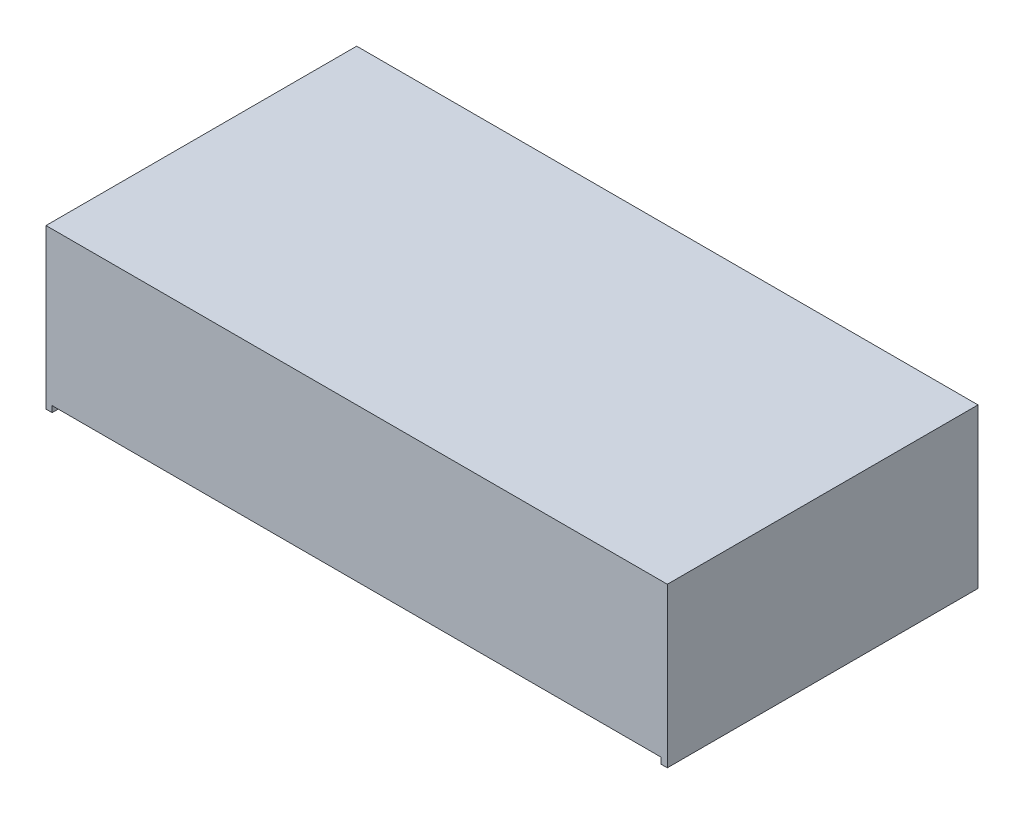
ISO-10303-21;
HEADER;
FILE_DESCRIPTION(('STEP AP214'),'2;1');
FILE_NAME('part.step','',(''),(''),'','','');
FILE_SCHEMA(('AUTOMOTIVE_DESIGN { 1 0 10303 214 1 1 1 1 }'));
ENDSEC;
DATA;
#1=APPLICATION_CONTEXT('core data for automotive mechanical design processes');
#2=APPLICATION_PROTOCOL_DEFINITION('international standard','automotive_design',2000,#1);
#3=PRODUCT_CONTEXT('',#1,'mechanical');
#4=PRODUCT('Part','Part','',(#3));
#5=PRODUCT_RELATED_PRODUCT_CATEGORY('part','',(#4));
#6=PRODUCT_DEFINITION_FORMATION('','',#4);
#7=PRODUCT_DEFINITION_CONTEXT('part definition',#1,'design');
#8=PRODUCT_DEFINITION('design','',#6,#7);
#9=PRODUCT_DEFINITION_SHAPE('','',#8);
#10=(LENGTH_UNIT() NAMED_UNIT(*) SI_UNIT(.MILLI.,.METRE.));
#11=(NAMED_UNIT(*) PLANE_ANGLE_UNIT() SI_UNIT($,.RADIAN.));
#12=(NAMED_UNIT(*) SI_UNIT($,.STERADIAN.) SOLID_ANGLE_UNIT());
#13=UNCERTAINTY_MEASURE_WITH_UNIT(LENGTH_MEASURE(1.E-05),#10,'distance_accuracy_value','');
#14=(GEOMETRIC_REPRESENTATION_CONTEXT(3) GLOBAL_UNCERTAINTY_ASSIGNED_CONTEXT((#13)) GLOBAL_UNIT_ASSIGNED_CONTEXT((#10,
#11,#12)) REPRESENTATION_CONTEXT('',''));
#15=CARTESIAN_POINT('',(0.,0.,0.));
#16=DIRECTION('',(0.,0.,1.));
#17=DIRECTION('',(1.,0.,0.));
#18=AXIS2_PLACEMENT_3D('',#15,#16,#17);
#19=CARTESIAN_POINT('',(25.4,0.,12.7));
#20=DIRECTION('',(0.,1.,0.));
#21=DIRECTION('',(0.,0.,1.));
#22=AXIS2_PLACEMENT_3D('',#19,#20,#21);
#23=PLANE('',#22);
#24=DIRECTION('',(-1.,0.,0.));
#25=VECTOR('',#24,1.);
#26=CARTESIAN_POINT('',(-25.4,0.,-12.7));
#27=LINE('',#26,#25);
#28=CARTESIAN_POINT('',(-24.9,0.,-12.7));
#29=VERTEX_POINT('',#28);
#30=CARTESIAN_POINT('',(-25.4,0.,-12.7));
#31=VERTEX_POINT('',#30);
#32=EDGE_CURVE('E122',#29,#31,#27,.T.);
#33=ORIENTED_EDGE('',*,*,#32,.F.);
#34=DIRECTION('',(0.,0.,-1.));
#35=VECTOR('',#34,1.);
#36=CARTESIAN_POINT('',(-24.9,0.,-12.701));
#37=LINE('',#36,#35);
#38=CARTESIAN_POINT('',(-24.9,0.,12.7));
#39=VERTEX_POINT('',#38);
#40=EDGE_CURVE('E107',#39,#29,#37,.T.);
#41=ORIENTED_EDGE('',*,*,#40,.F.);
#42=DIRECTION('',(1.,0.,0.));
#43=VECTOR('',#42,1.);
#44=CARTESIAN_POINT('',(-25.4,0.,12.7));
#45=LINE('',#44,#43);
#46=CARTESIAN_POINT('',(-25.4,0.,12.7));
#47=VERTEX_POINT('',#46);
#48=EDGE_CURVE('E121',#47,#39,#45,.T.);
#49=ORIENTED_EDGE('',*,*,#48,.F.);
#50=DIRECTION('',(0.,0.,1.));
#51=VECTOR('',#50,1.);
#52=CARTESIAN_POINT('',(-25.4,0.,-12.7));
#53=LINE('',#52,#51);
#54=EDGE_CURVE('E133',#31,#47,#53,.T.);
#55=ORIENTED_EDGE('',*,*,#54,.F.);
#56=EDGE_LOOP('',(#33,#41,#49,#55));
#57=FACE_BOUND('',#56,.T.);
#58=ADVANCED_FACE('F30',(#57),#23,.F.);
#59=CARTESIAN_POINT('',(25.4,13.,-12.7));
#60=DIRECTION('',(-1.,0.,0.));
#61=DIRECTION('',(0.,0.,1.));
#62=AXIS2_PLACEMENT_3D('',#59,#60,#61);
#63=PLANE('',#62);
#64=DIRECTION('',(0.,0.,-1.));
#65=VECTOR('',#64,1.);
#66=CARTESIAN_POINT('',(25.4,0.,-12.7));
#67=LINE('',#66,#65);
#68=CARTESIAN_POINT('',(25.4,0.,12.7));
#69=VERTEX_POINT('',#68);
#70=CARTESIAN_POINT('',(25.4,0.,-12.7));
#71=VERTEX_POINT('',#70);
#72=EDGE_CURVE('E146',#69,#71,#67,.T.);
#73=ORIENTED_EDGE('',*,*,#72,.T.);
#74=DIRECTION('',(0.,-1.,0.));
#75=VECTOR('',#74,1.);
#76=CARTESIAN_POINT('',(25.4,13.,-12.7));
#77=LINE('',#76,#75);
#78=CARTESIAN_POINT('',(25.4,13.,-12.7));
#79=VERTEX_POINT('',#78);
#80=EDGE_CURVE('E11',#79,#71,#77,.T.);
#81=ORIENTED_EDGE('',*,*,#80,.F.);
#82=DIRECTION('',(0.,0.,-1.));
#83=VECTOR('',#82,1.);
#84=CARTESIAN_POINT('',(25.4,13.,-12.7));
#85=LINE('',#84,#83);
#86=CARTESIAN_POINT('',(25.4,13.,12.7));
#87=VERTEX_POINT('',#86);
#88=EDGE_CURVE('E130',#87,#79,#85,.T.);
#89=ORIENTED_EDGE('',*,*,#88,.F.);
#90=DIRECTION('',(0.,-1.,0.));
#91=VECTOR('',#90,1.);
#92=CARTESIAN_POINT('',(25.4,13.,12.7));
#93=LINE('',#92,#91);
#94=EDGE_CURVE('E137',#87,#69,#93,.T.);
#95=ORIENTED_EDGE('',*,*,#94,.T.);
#96=EDGE_LOOP('',(#73,#81,#89,#95));
#97=FACE_BOUND('',#96,.T.);
#98=ADVANCED_FACE('F32',(#97),#63,.F.);
#99=CARTESIAN_POINT('',(-25.4,13.,-12.7));
#100=DIRECTION('',(0.,0.,1.));
#101=DIRECTION('',(1.,0.,0.));
#102=AXIS2_PLACEMENT_3D('',#99,#100,#101);
#103=PLANE('',#102);
#104=DIRECTION('',(1.,0.,0.));
#105=VECTOR('',#104,1.);
#106=CARTESIAN_POINT('',(-24.9,0.5,-12.7));
#107=LINE('',#106,#105);
#108=CARTESIAN_POINT('',(-24.9,0.5,-12.7));
#109=VERTEX_POINT('',#108);
#110=CARTESIAN_POINT('',(24.9,0.5,-12.7));
#111=VERTEX_POINT('',#110);
#112=EDGE_CURVE('E123',#109,#111,#107,.T.);
#113=ORIENTED_EDGE('',*,*,#112,.F.);
#114=DIRECTION('',(0.,1.,0.));
#115=VECTOR('',#114,1.);
#116=CARTESIAN_POINT('',(-24.9,-2.02561011150705,-12.7));
#117=LINE('',#116,#115);
#118=EDGE_CURVE('E115',#29,#109,#117,.T.);
#119=ORIENTED_EDGE('',*,*,#118,.F.);
#120=ORIENTED_EDGE('',*,*,#32,.T.);
#121=DIRECTION('',(0.,-1.,0.));
#122=VECTOR('',#121,1.);
#123=CARTESIAN_POINT('',(-25.4,13.,-12.7));
#124=LINE('',#123,#122);
#125=CARTESIAN_POINT('',(-25.4,13.,-12.7));
#126=VERTEX_POINT('',#125);
#127=EDGE_CURVE('E38',#126,#31,#124,.T.);
#128=ORIENTED_EDGE('',*,*,#127,.F.);
#129=DIRECTION('',(-1.,0.,0.));
#130=VECTOR('',#129,1.);
#131=CARTESIAN_POINT('',(-25.4,13.,-12.7));
#132=LINE('',#131,#130);
#133=EDGE_CURVE('E82',#79,#126,#132,.T.);
#134=ORIENTED_EDGE('',*,*,#133,.F.);
#135=ORIENTED_EDGE('',*,*,#80,.T.);
#136=CARTESIAN_POINT('',(24.9,0.,-12.7));
#137=VERTEX_POINT('',#136);
#138=EDGE_CURVE('E144',#71,#137,#27,.T.);
#139=ORIENTED_EDGE('',*,*,#138,.T.);
#140=DIRECTION('',(0.,-1.,0.));
#141=VECTOR('',#140,1.);
#142=CARTESIAN_POINT('',(24.9,-2.02561011150705,-12.7));
#143=LINE('',#142,#141);
#144=EDGE_CURVE('E45',#111,#137,#143,.T.);
#145=ORIENTED_EDGE('',*,*,#144,.F.);
#146=EDGE_LOOP('',(#113,#119,#120,#128,#134,#135,#139,#145));
#147=FACE_BOUND('',#146,.T.);
#148=ADVANCED_FACE('F184',(#147),#103,.F.);
#149=CARTESIAN_POINT('',(-25.4,13.,-12.7));
#150=DIRECTION('',(1.,0.,0.));
#151=DIRECTION('',(0.,0.,-1.));
#152=AXIS2_PLACEMENT_3D('',#149,#150,#151);
#153=PLANE('',#152);
#154=ORIENTED_EDGE('',*,*,#54,.T.);
#155=DIRECTION('',(0.,-1.,0.));
#156=VECTOR('',#155,1.);
#157=CARTESIAN_POINT('',(-25.4,13.,12.7));
#158=LINE('',#157,#156);
#159=CARTESIAN_POINT('',(-25.4,13.,12.7));
#160=VERTEX_POINT('',#159);
#161=EDGE_CURVE('E129',#160,#47,#158,.T.);
#162=ORIENTED_EDGE('',*,*,#161,.F.);
#163=DIRECTION('',(0.,0.,1.));
#164=VECTOR('',#163,1.);
#165=CARTESIAN_POINT('',(-25.4,13.,-12.7));
#166=LINE('',#165,#164);
#167=EDGE_CURVE('E143',#126,#160,#166,.T.);
#168=ORIENTED_EDGE('',*,*,#167,.F.);
#169=ORIENTED_EDGE('',*,*,#127,.T.);
#170=EDGE_LOOP('',(#154,#162,#168,#169));
#171=FACE_BOUND('',#170,.T.);
#172=ADVANCED_FACE('F142',(#171),#153,.F.);
#173=CARTESIAN_POINT('',(-25.4,13.,12.7));
#174=DIRECTION('',(0.,0.,-1.));
#175=DIRECTION('',(-1.,0.,0.));
#176=AXIS2_PLACEMENT_3D('',#173,#174,#175);
#177=PLANE('',#176);
#178=ORIENTED_EDGE('',*,*,#48,.T.);
#179=DIRECTION('',(0.,-1.,0.));
#180=VECTOR('',#179,1.);
#181=CARTESIAN_POINT('',(-24.9,-2.02561011150705,12.7));
#182=LINE('',#181,#180);
#183=CARTESIAN_POINT('',(-24.9,0.5,12.7));
#184=VERTEX_POINT('',#183);
#185=EDGE_CURVE('E104',#184,#39,#182,.T.);
#186=ORIENTED_EDGE('',*,*,#185,.F.);
#187=DIRECTION('',(-1.,0.,0.));
#188=VECTOR('',#187,1.);
#189=CARTESIAN_POINT('',(-24.9,0.5,12.7));
#190=LINE('',#189,#188);
#191=CARTESIAN_POINT('',(24.9,0.5,12.7));
#192=VERTEX_POINT('',#191);
#193=EDGE_CURVE('E156',#192,#184,#190,.T.);
#194=ORIENTED_EDGE('',*,*,#193,.F.);
#195=DIRECTION('',(0.,1.,0.));
#196=VECTOR('',#195,1.);
#197=CARTESIAN_POINT('',(24.9,-2.02561011150705,12.7));
#198=LINE('',#197,#196);
#199=CARTESIAN_POINT('',(24.9,0.,12.7));
#200=VERTEX_POINT('',#199);
#201=EDGE_CURVE('E114',#200,#192,#198,.T.);
#202=ORIENTED_EDGE('',*,*,#201,.F.);
#203=EDGE_CURVE('E75',#200,#69,#45,.T.);
#204=ORIENTED_EDGE('',*,*,#203,.T.);
#205=ORIENTED_EDGE('',*,*,#94,.F.);
#206=DIRECTION('',(1.,0.,0.));
#207=VECTOR('',#206,1.);
#208=CARTESIAN_POINT('',(-25.4,13.,12.7));
#209=LINE('',#208,#207);
#210=EDGE_CURVE('E54',#160,#87,#209,.T.);
#211=ORIENTED_EDGE('',*,*,#210,.F.);
#212=ORIENTED_EDGE('',*,*,#161,.T.);
#213=EDGE_LOOP('',(#178,#186,#194,#202,#204,#205,#211,#212));
#214=FACE_BOUND('',#213,.T.);
#215=ADVANCED_FACE('F127',(#214),#177,.F.);
#216=CARTESIAN_POINT('',(25.4,13.,12.7));
#217=DIRECTION('',(0.,1.,0.));
#218=DIRECTION('',(0.,0.,1.));
#219=AXIS2_PLACEMENT_3D('',#216,#217,#218);
#220=PLANE('',#219);
#221=ORIENTED_EDGE('',*,*,#88,.T.);
#222=ORIENTED_EDGE('',*,*,#133,.T.);
#223=ORIENTED_EDGE('',*,*,#167,.T.);
#224=ORIENTED_EDGE('',*,*,#210,.T.);
#225=EDGE_LOOP('',(#221,#222,#223,#224));
#226=FACE_BOUND('',#225,.T.);
#227=ADVANCED_FACE('F170',(#226),#220,.T.);
#228=ORIENTED_EDGE('',*,*,#203,.F.);
#229=DIRECTION('',(0.,0.,1.));
#230=VECTOR('',#229,1.);
#231=CARTESIAN_POINT('',(24.9,0.,-12.701));
#232=LINE('',#231,#230);
#233=EDGE_CURVE('E124',#137,#200,#232,.T.);
#234=ORIENTED_EDGE('',*,*,#233,.F.);
#235=ORIENTED_EDGE('',*,*,#138,.F.);
#236=ORIENTED_EDGE('',*,*,#72,.F.);
#237=EDGE_LOOP('',(#228,#234,#235,#236));
#238=FACE_BOUND('',#237,.T.);
#239=ADVANCED_FACE('F166',(#238),#23,.F.);
#240=CARTESIAN_POINT('',(-24.9,-2.02561011150705,-12.701));
#241=DIRECTION('',(-1.,0.,0.));
#242=DIRECTION('',(0.,0.,1.));
#243=AXIS2_PLACEMENT_3D('',#240,#241,#242);
#244=PLANE('',#243);
#245=ORIENTED_EDGE('',*,*,#118,.T.);
#246=DIRECTION('',(0.,0.,1.));
#247=VECTOR('',#246,1.);
#248=CARTESIAN_POINT('',(-24.9,0.5,-12.701));
#249=LINE('',#248,#247);
#250=EDGE_CURVE('E110',#109,#184,#249,.T.);
#251=ORIENTED_EDGE('',*,*,#250,.T.);
#252=ORIENTED_EDGE('',*,*,#185,.T.);
#253=ORIENTED_EDGE('',*,*,#40,.T.);
#254=EDGE_LOOP('',(#245,#251,#252,#253));
#255=FACE_BOUND('',#254,.T.);
#256=ADVANCED_FACE('F106',(#255),#244,.F.);
#257=CARTESIAN_POINT('',(-24.9,0.5,-12.701));
#258=DIRECTION('',(0.,1.,0.));
#259=DIRECTION('',(0.,0.,1.));
#260=AXIS2_PLACEMENT_3D('',#257,#258,#259);
#261=PLANE('',#260);
#262=ORIENTED_EDGE('',*,*,#112,.T.);
#263=DIRECTION('',(0.,0.,1.));
#264=VECTOR('',#263,1.);
#265=CARTESIAN_POINT('',(24.9,0.5,-12.701));
#266=LINE('',#265,#264);
#267=EDGE_CURVE('E154',#111,#192,#266,.T.);
#268=ORIENTED_EDGE('',*,*,#267,.T.);
#269=ORIENTED_EDGE('',*,*,#193,.T.);
#270=ORIENTED_EDGE('',*,*,#250,.F.);
#271=EDGE_LOOP('',(#262,#268,#269,#270));
#272=FACE_BOUND('',#271,.T.);
#273=ADVANCED_FACE('F192',(#272),#261,.F.);
#274=CARTESIAN_POINT('',(24.9,-2.02561011150705,-12.701));
#275=DIRECTION('',(1.,0.,0.));
#276=DIRECTION('',(0.,0.,-1.));
#277=AXIS2_PLACEMENT_3D('',#274,#275,#276);
#278=PLANE('',#277);
#279=ORIENTED_EDGE('',*,*,#144,.T.);
#280=ORIENTED_EDGE('',*,*,#233,.T.);
#281=ORIENTED_EDGE('',*,*,#201,.T.);
#282=ORIENTED_EDGE('',*,*,#267,.F.);
#283=EDGE_LOOP('',(#279,#280,#281,#282));
#284=FACE_BOUND('',#283,.T.);
#285=ADVANCED_FACE('F163',(#284),#278,.F.);
#286=CLOSED_SHELL('',(#58,#98,#148,#172,#215,#227,#239,#256,#273,#285));
#287=MANIFOLD_SOLID_BREP('B2',#286);
#288=ADVANCED_BREP_SHAPE_REPRESENTATION('',(#18,#287),#14);
#289=SHAPE_DEFINITION_REPRESENTATION(#9,#288);
ENDSEC;
END-ISO-10303-21;
